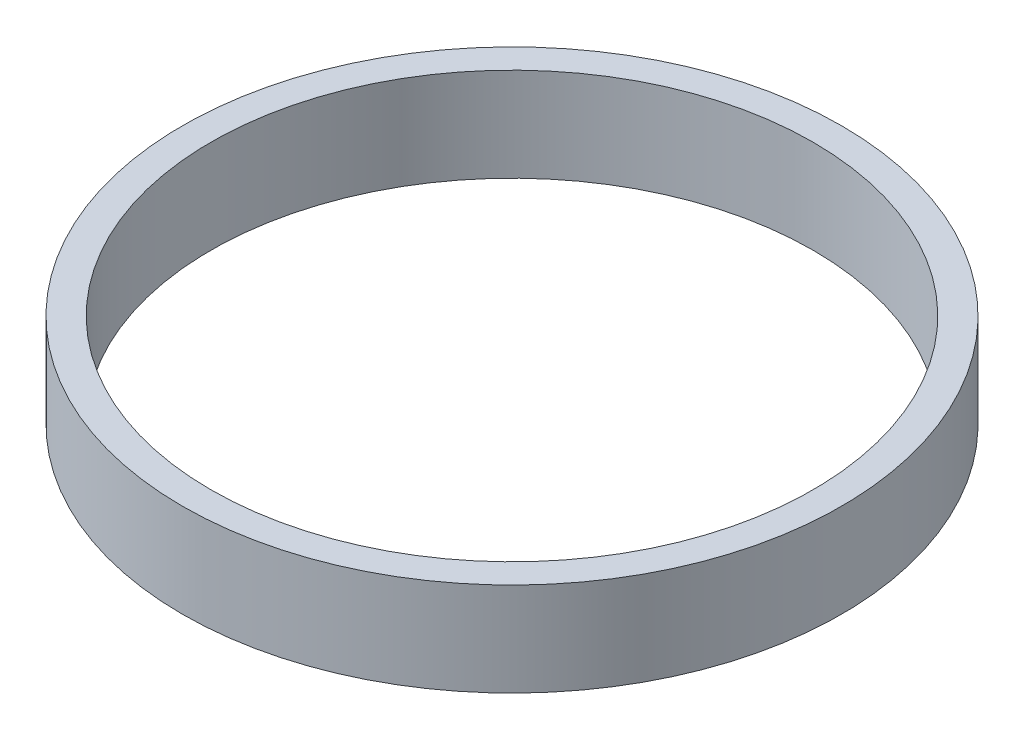
ISO-10303-21;
HEADER;
FILE_DESCRIPTION(('STEP AP214'),'2;1');
FILE_NAME('part.step','',(''),(''),'','','');
FILE_SCHEMA(('AUTOMOTIVE_DESIGN { 1 0 10303 214 1 1 1 1 }'));
ENDSEC;
DATA;
#1=APPLICATION_CONTEXT('core data for automotive mechanical design processes');
#2=APPLICATION_PROTOCOL_DEFINITION('international standard','automotive_design',2000,#1);
#3=PRODUCT_CONTEXT('',#1,'mechanical');
#4=PRODUCT('Part','Part','',(#3));
#5=PRODUCT_RELATED_PRODUCT_CATEGORY('part','',(#4));
#6=PRODUCT_DEFINITION_FORMATION('','',#4);
#7=PRODUCT_DEFINITION_CONTEXT('part definition',#1,'design');
#8=PRODUCT_DEFINITION('design','',#6,#7);
#9=PRODUCT_DEFINITION_SHAPE('','',#8);
#10=(LENGTH_UNIT() NAMED_UNIT(*) SI_UNIT(.MILLI.,.METRE.));
#11=(NAMED_UNIT(*) PLANE_ANGLE_UNIT() SI_UNIT($,.RADIAN.));
#12=(NAMED_UNIT(*) SI_UNIT($,.STERADIAN.) SOLID_ANGLE_UNIT());
#13=UNCERTAINTY_MEASURE_WITH_UNIT(LENGTH_MEASURE(1.E-05),#10,'distance_accuracy_value','');
#14=(GEOMETRIC_REPRESENTATION_CONTEXT(3) GLOBAL_UNCERTAINTY_ASSIGNED_CONTEXT((#13)) GLOBAL_UNIT_ASSIGNED_CONTEXT((#10,
#11,#12)) REPRESENTATION_CONTEXT('',''));
#15=CARTESIAN_POINT('',(0.,0.,0.));
#16=DIRECTION('',(0.,0.,1.));
#17=DIRECTION('',(1.,0.,0.));
#18=AXIS2_PLACEMENT_3D('',#15,#16,#17);
#19=CARTESIAN_POINT('',(0.,18.,0.));
#20=DIRECTION('',(0.,-1.,0.));
#21=DIRECTION('',(0.,0.,-1.));
#22=AXIS2_PLACEMENT_3D('',#19,#20,#21);
#23=CYLINDRICAL_SURFACE('',#22,40.5);
#24=CARTESIAN_POINT('',(0.,18.,0.));
#25=DIRECTION('',(0.,1.,0.));
#26=DIRECTION('',(0.,0.,1.));
#27=AXIS2_PLACEMENT_3D('',#24,#25,#26);
#28=CIRCLE('',#27,40.5);
#29=CARTESIAN_POINT('',(0.,18.,40.5));
#30=VERTEX_POINT('',#29);
#31=EDGE_CURVE('E10',#30,#30,#28,.T.);
#32=ORIENTED_EDGE('',*,*,#31,.F.);
#33=EDGE_LOOP('',(#32));
#34=FACE_BOUND('',#33,.T.);
#35=CARTESIAN_POINT('',(0.,6.5,0.));
#36=DIRECTION('',(0.,1.,0.));
#37=DIRECTION('',(0.,0.,1.));
#38=AXIS2_PLACEMENT_3D('',#35,#36,#37);
#39=CIRCLE('',#38,40.5);
#40=CARTESIAN_POINT('',(0.,6.5,40.5));
#41=VERTEX_POINT('',#40);
#42=EDGE_CURVE('E44',#41,#41,#39,.T.);
#43=ORIENTED_EDGE('',*,*,#42,.T.);
#44=EDGE_LOOP('',(#43));
#45=FACE_BOUND('',#44,.T.);
#46=ADVANCED_FACE('F37',(#34,#45),#23,.T.);
#47=CARTESIAN_POINT('',(0.,18.,0.));
#48=DIRECTION('',(0.,1.,0.));
#49=DIRECTION('',(0.,0.,1.));
#50=AXIS2_PLACEMENT_3D('',#47,#48,#49);
#51=PLANE('',#50);
#52=CARTESIAN_POINT('',(0.,18.,0.));
#53=DIRECTION('',(0.,1.,0.));
#54=DIRECTION('',(0.,0.,1.));
#55=AXIS2_PLACEMENT_3D('',#52,#53,#54);
#56=CIRCLE('',#55,37.);
#57=CARTESIAN_POINT('',(0.,18.,37.));
#58=VERTEX_POINT('',#57);
#59=EDGE_CURVE('E49',#58,#58,#56,.F.);
#60=ORIENTED_EDGE('',*,*,#59,.T.);
#61=EDGE_LOOP('',(#60));
#62=FACE_BOUND('',#61,.T.);
#63=ORIENTED_EDGE('',*,*,#31,.T.);
#64=EDGE_LOOP('',(#63));
#65=FACE_BOUND('',#64,.T.);
#66=ADVANCED_FACE('F62',(#62,#65),#51,.T.);
#67=CARTESIAN_POINT('',(0.,6.5,0.));
#68=DIRECTION('',(0.,1.,0.));
#69=DIRECTION('',(0.,0.,1.));
#70=AXIS2_PLACEMENT_3D('',#67,#68,#69);
#71=PLANE('',#70);
#72=CARTESIAN_POINT('',(0.,6.5,0.));
#73=DIRECTION('',(0.,1.,0.));
#74=DIRECTION('',(0.,0.,1.));
#75=AXIS2_PLACEMENT_3D('',#72,#73,#74);
#76=CIRCLE('',#75,37.);
#77=CARTESIAN_POINT('',(0.,6.5,37.));
#78=VERTEX_POINT('',#77);
#79=EDGE_CURVE('E40',#78,#78,#76,.F.);
#80=ORIENTED_EDGE('',*,*,#79,.F.);
#81=EDGE_LOOP('',(#80));
#82=FACE_BOUND('',#81,.T.);
#83=ORIENTED_EDGE('',*,*,#42,.F.);
#84=EDGE_LOOP('',(#83));
#85=FACE_BOUND('',#84,.T.);
#86=ADVANCED_FACE('F59',(#82,#85),#71,.F.);
#87=CARTESIAN_POINT('',(0.,19.,0.));
#88=DIRECTION('',(0.,-1.,0.));
#89=DIRECTION('',(0.,0.,-1.));
#90=AXIS2_PLACEMENT_3D('',#87,#88,#89);
#91=CYLINDRICAL_SURFACE('',#90,37.);
#92=ORIENTED_EDGE('',*,*,#59,.F.);
#93=EDGE_LOOP('',(#92));
#94=FACE_BOUND('',#93,.T.);
#95=ORIENTED_EDGE('',*,*,#79,.T.);
#96=EDGE_LOOP('',(#95));
#97=FACE_BOUND('',#96,.T.);
#98=ADVANCED_FACE('F57',(#94,#97),#91,.F.);
#99=CLOSED_SHELL('',(#46,#66,#86,#98));
#100=MANIFOLD_SOLID_BREP('B2',#99);
#101=ADVANCED_BREP_SHAPE_REPRESENTATION('',(#18,#100),#14);
#102=SHAPE_DEFINITION_REPRESENTATION(#9,#101);
ENDSEC;
END-ISO-10303-21;
